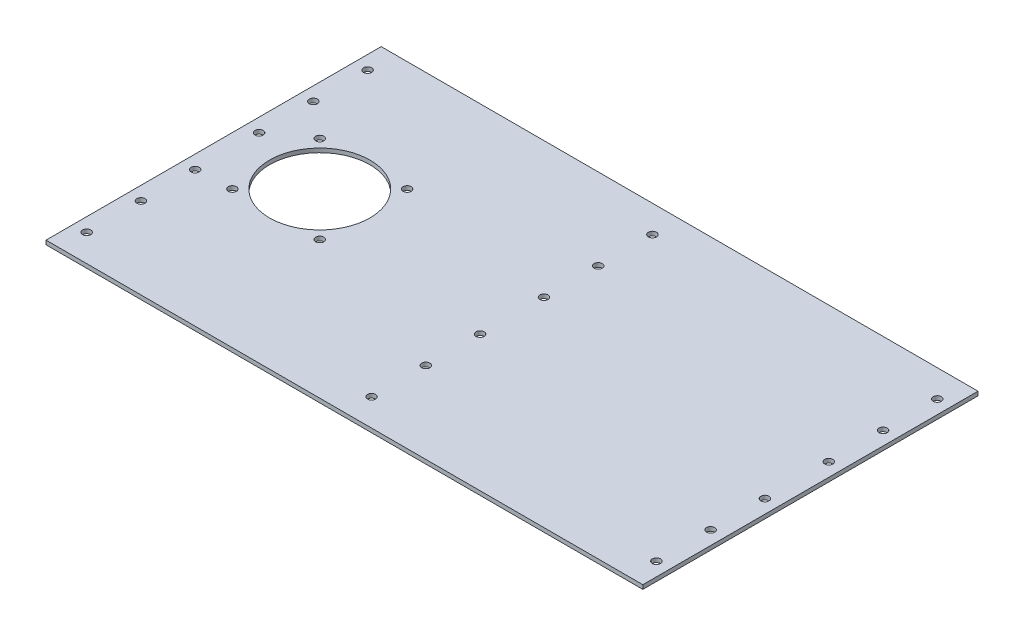
ISO-10303-21;
HEADER;
FILE_DESCRIPTION(('STEP AP214'),'2;1');
FILE_NAME('part.step','',(''),(''),'','','');
FILE_SCHEMA(('AUTOMOTIVE_DESIGN { 1 0 10303 214 1 1 1 1 }'));
ENDSEC;
DATA;
#1=APPLICATION_CONTEXT('core data for automotive mechanical design processes');
#2=APPLICATION_PROTOCOL_DEFINITION('international standard','automotive_design',2000,#1);
#3=PRODUCT_CONTEXT('',#1,'mechanical');
#4=PRODUCT('Part','Part','',(#3));
#5=PRODUCT_RELATED_PRODUCT_CATEGORY('part','',(#4));
#6=PRODUCT_DEFINITION_FORMATION('','',#4);
#7=PRODUCT_DEFINITION_CONTEXT('part definition',#1,'design');
#8=PRODUCT_DEFINITION('design','',#6,#7);
#9=PRODUCT_DEFINITION_SHAPE('','',#8);
#10=(LENGTH_UNIT() NAMED_UNIT(*) SI_UNIT(.MILLI.,.METRE.));
#11=(NAMED_UNIT(*) PLANE_ANGLE_UNIT() SI_UNIT($,.RADIAN.));
#12=(NAMED_UNIT(*) SI_UNIT($,.STERADIAN.) SOLID_ANGLE_UNIT());
#13=UNCERTAINTY_MEASURE_WITH_UNIT(LENGTH_MEASURE(1.E-05),#10,'distance_accuracy_value','');
#14=(GEOMETRIC_REPRESENTATION_CONTEXT(3) GLOBAL_UNCERTAINTY_ASSIGNED_CONTEXT((#13)) GLOBAL_UNIT_ASSIGNED_CONTEXT((#10,
#11,#12)) REPRESENTATION_CONTEXT('',''));
#15=CARTESIAN_POINT('',(0.,0.,0.));
#16=DIRECTION('',(0.,0.,1.));
#17=DIRECTION('',(1.,0.,0.));
#18=AXIS2_PLACEMENT_3D('',#15,#16,#17);
#19=CARTESIAN_POINT('',(0.,1.5,0.));
#20=DIRECTION('',(0.,1.,0.));
#21=DIRECTION('',(0.,0.,1.));
#22=AXIS2_PLACEMENT_3D('',#19,#20,#21);
#23=PLANE('',#22);
#24=CARTESIAN_POINT('',(149.295012832051,1.5,29.2327474052838));
#25=DIRECTION('',(0.,1.,0.));
#26=DIRECTION('',(0.,0.,1.));
#27=AXIS2_PLACEMENT_3D('',#24,#25,#26);
#28=CIRCLE('',#27,1.5);
#29=CARTESIAN_POINT('',(149.295012832051,1.5,30.7327474052838));
#30=VERTEX_POINT('',#29);
#31=EDGE_CURVE('E368',#30,#30,#28,.T.);
#32=ORIENTED_EDGE('',*,*,#31,.F.);
#33=EDGE_LOOP('',(#32));
#34=FACE_BOUND('',#33,.T.);
#35=CARTESIAN_POINT('',(44.295012832051,1.5,5.6827474052803));
#36=DIRECTION('',(0.,1.,0.));
#37=DIRECTION('',(0.,0.,1.));
#38=AXIS2_PLACEMENT_3D('',#35,#36,#37);
#39=CIRCLE('',#38,1.50000000000293);
#40=CARTESIAN_POINT('',(44.295012832051,1.5,7.18274740528324));
#41=VERTEX_POINT('',#40);
#42=EDGE_CURVE('E377',#41,#41,#39,.F.);
#43=ORIENTED_EDGE('',*,*,#42,.T.);
#44=EDGE_LOOP('',(#43));
#45=FACE_BOUND('',#44,.T.);
#46=CARTESIAN_POINT('',(44.2950128320511,1.5,-14.3172525947198));
#47=DIRECTION('',(0.,1.,0.));
#48=DIRECTION('',(0.,0.,1.));
#49=AXIS2_PLACEMENT_3D('',#46,#47,#48);
#50=CIRCLE('',#49,1.49999999999818);
#51=CARTESIAN_POINT('',(44.2950128320511,1.5,-12.8172525947216));
#52=VERTEX_POINT('',#51);
#53=EDGE_CURVE('E350',#52,#52,#50,.F.);
#54=ORIENTED_EDGE('',*,*,#53,.T.);
#55=EDGE_LOOP('',(#54));
#56=FACE_BOUND('',#55,.T.);
#57=CARTESIAN_POINT('',(149.295012832051,1.5,-14.3172525947162));
#58=DIRECTION('',(0.,1.,0.));
#59=DIRECTION('',(0.,0.,1.));
#60=AXIS2_PLACEMENT_3D('',#57,#58,#59);
#61=CIRCLE('',#60,1.49999999999902);
#62=CARTESIAN_POINT('',(149.295012832051,1.5,-12.8172525947171));
#63=VERTEX_POINT('',#62);
#64=EDGE_CURVE('E351',#63,#63,#61,.F.);
#65=ORIENTED_EDGE('',*,*,#64,.T.);
#66=EDGE_LOOP('',(#65));
#67=FACE_BOUND('',#66,.T.);
#68=CARTESIAN_POINT('',(-60.7049871679488,1.5,-34.3172525947235));
#69=DIRECTION('',(0.,1.,0.));
#70=DIRECTION('',(0.,0.,1.));
#71=AXIS2_PLACEMENT_3D('',#68,#69,#70);
#72=CIRCLE('',#71,1.49999999999731);
#73=CARTESIAN_POINT('',(-60.7049871679488,1.5,-32.8172525947262));
#74=VERTEX_POINT('',#73);
#75=EDGE_CURVE('E359',#74,#74,#72,.F.);
#76=ORIENTED_EDGE('',*,*,#75,.T.);
#77=EDGE_LOOP('',(#76));
#78=FACE_BOUND('',#77,.T.);
#79=DIRECTION('',(0.,0.,1.));
#80=VECTOR('',#79,1.);
#81=CARTESIAN_POINT('',(-65.7049871679489,1.5,-44.3172525947162));
#82=LINE('',#81,#80);
#83=CARTESIAN_POINT('',(-65.7049871679489,1.5,-44.3172525947162));
#84=VERTEX_POINT('',#83);
#85=CARTESIAN_POINT('',(-65.7049871679489,1.5,79.2327474052838));
#86=VERTEX_POINT('',#85);
#87=EDGE_CURVE('E113',#84,#86,#82,.T.);
#88=ORIENTED_EDGE('',*,*,#87,.T.);
#89=DIRECTION('',(1.,0.,0.));
#90=VECTOR('',#89,1.);
#91=CARTESIAN_POINT('',(-65.7049871679489,1.5,79.2327474052838));
#92=LINE('',#91,#90);
#93=CARTESIAN_POINT('',(154.295012832051,1.5,79.2327474052838));
#94=VERTEX_POINT('',#93);
#95=EDGE_CURVE('E108',#86,#94,#92,.T.);
#96=ORIENTED_EDGE('',*,*,#95,.T.);
#97=DIRECTION('',(0.,0.,-1.));
#98=VECTOR('',#97,1.);
#99=CARTESIAN_POINT('',(154.295012832051,1.5,-44.3172525947162));
#100=LINE('',#99,#98);
#101=CARTESIAN_POINT('',(154.295012832051,1.5,-44.3172525947162));
#102=VERTEX_POINT('',#101);
#103=EDGE_CURVE('E111',#94,#102,#100,.T.);
#104=ORIENTED_EDGE('',*,*,#103,.T.);
#105=DIRECTION('',(-1.,0.,0.));
#106=VECTOR('',#105,1.);
#107=CARTESIAN_POINT('',(-65.7049871679489,1.5,-44.3172525947162));
#108=LINE('',#107,#106);
#109=EDGE_CURVE('E78',#102,#84,#108,.T.);
#110=ORIENTED_EDGE('',*,*,#109,.T.);
#111=EDGE_LOOP('',(#88,#96,#104,#110));
#112=FACE_BOUND('',#111,.T.);
#113=CARTESIAN_POINT('',(149.295012832051,1.5,49.2327474052838));
#114=DIRECTION('',(0.,1.,0.));
#115=DIRECTION('',(0.,0.,1.));
#116=AXIS2_PLACEMENT_3D('',#113,#114,#115);
#117=CIRCLE('',#116,1.5);
#118=CARTESIAN_POINT('',(149.295012832051,1.5,50.7327474052838));
#119=VERTEX_POINT('',#118);
#120=EDGE_CURVE('E138',#119,#119,#117,.T.);
#121=ORIENTED_EDGE('',*,*,#120,.F.);
#122=EDGE_LOOP('',(#121));
#123=FACE_BOUND('',#122,.T.);
#124=CARTESIAN_POINT('',(-15.4703126495416,1.5,28.5577474052838));
#125=DIRECTION('',(0.,1.,0.));
#126=DIRECTION('',(0.,0.,1.));
#127=AXIS2_PLACEMENT_3D('',#124,#125,#126);
#128=CIRCLE('',#127,1.5);
#129=CARTESIAN_POINT('',(-15.4703126495416,1.5,30.0577474052838));
#130=VERTEX_POINT('',#129);
#131=EDGE_CURVE('E397',#130,#130,#128,.T.);
#132=ORIENTED_EDGE('',*,*,#131,.F.);
#133=EDGE_LOOP('',(#132));
#134=FACE_BOUND('',#133,.T.);
#135=CARTESIAN_POINT('',(-15.4703126495419,1.5,-3.64225259471624));
#136=DIRECTION('',(0.,1.,0.));
#137=DIRECTION('',(0.,0.,1.));
#138=AXIS2_PLACEMENT_3D('',#135,#136,#137);
#139=CIRCLE('',#138,1.5);
#140=CARTESIAN_POINT('',(-15.4703126495419,1.5,-2.14225259471624));
#141=VERTEX_POINT('',#140);
#142=EDGE_CURVE('E394',#141,#141,#139,.T.);
#143=ORIENTED_EDGE('',*,*,#142,.F.);
#144=EDGE_LOOP('',(#143));
#145=FACE_BOUND('',#144,.T.);
#146=CARTESIAN_POINT('',(-47.6703126495419,1.5,-3.64225259471624));
#147=DIRECTION('',(0.,1.,0.));
#148=DIRECTION('',(0.,0.,1.));
#149=AXIS2_PLACEMENT_3D('',#146,#147,#148);
#150=CIRCLE('',#149,1.5);
#151=CARTESIAN_POINT('',(-47.6703126495419,1.5,-2.14225259471624));
#152=VERTEX_POINT('',#151);
#153=EDGE_CURVE('E391',#152,#152,#150,.T.);
#154=ORIENTED_EDGE('',*,*,#153,.F.);
#155=EDGE_LOOP('',(#154));
#156=FACE_BOUND('',#155,.T.);
#157=CARTESIAN_POINT('',(149.295012832051,1.5,69.2327474052839));
#158=DIRECTION('',(0.,1.,0.));
#159=DIRECTION('',(0.,0.,1.));
#160=AXIS2_PLACEMENT_3D('',#157,#158,#159);
#161=CIRCLE('',#160,1.50000000000005);
#162=CARTESIAN_POINT('',(149.295012832051,1.5,70.732747405284));
#163=VERTEX_POINT('',#162);
#164=EDGE_CURVE('E371',#163,#163,#161,.T.);
#165=ORIENTED_EDGE('',*,*,#164,.F.);
#166=EDGE_LOOP('',(#165));
#167=FACE_BOUND('',#166,.T.);
#168=CARTESIAN_POINT('',(-31.5703126495419,1.5,12.4577474052838));
#169=DIRECTION('',(0.,1.,0.));
#170=DIRECTION('',(0.,0.,1.));
#171=AXIS2_PLACEMENT_3D('',#168,#169,#170);
#172=CIRCLE('',#171,18.5);
#173=CARTESIAN_POINT('',(-31.5703126495419,1.5,30.9577474052838));
#174=VERTEX_POINT('',#173);
#175=EDGE_CURVE('E321',#174,#174,#172,.T.);
#176=ORIENTED_EDGE('',*,*,#175,.F.);
#177=EDGE_LOOP('',(#176));
#178=FACE_BOUND('',#177,.T.);
#179=CARTESIAN_POINT('',(-47.6703126495416,1.5,28.5577474052838));
#180=DIRECTION('',(0.,1.,0.));
#181=DIRECTION('',(0.,0.,1.));
#182=AXIS2_PLACEMENT_3D('',#179,#180,#181);
#183=CIRCLE('',#182,1.5);
#184=CARTESIAN_POINT('',(-47.6703126495416,1.5,30.0577474052838));
#185=VERTEX_POINT('',#184);
#186=EDGE_CURVE('E400',#185,#185,#183,.T.);
#187=ORIENTED_EDGE('',*,*,#186,.F.);
#188=EDGE_LOOP('',(#187));
#189=FACE_BOUND('',#188,.T.);
#190=CARTESIAN_POINT('',(-60.7049871679489,1.5,-14.3172525947234));
#191=DIRECTION('',(0.,1.,0.));
#192=DIRECTION('',(0.,0.,1.));
#193=AXIS2_PLACEMENT_3D('',#190,#191,#192);
#194=CIRCLE('',#193,1.49999999999733);
#195=CARTESIAN_POINT('',(-60.7049871679489,1.5,-12.8172525947261));
#196=VERTEX_POINT('',#195);
#197=EDGE_CURVE('E356',#196,#196,#194,.F.);
#198=ORIENTED_EDGE('',*,*,#197,.T.);
#199=EDGE_LOOP('',(#198));
#200=FACE_BOUND('',#199,.T.);
#201=CARTESIAN_POINT('',(149.295012832051,1.5,-34.3172525947162));
#202=DIRECTION('',(0.,1.,0.));
#203=DIRECTION('',(0.,0.,1.));
#204=AXIS2_PLACEMENT_3D('',#201,#202,#203);
#205=CIRCLE('',#204,1.49999999999899);
#206=CARTESIAN_POINT('',(149.295012832051,1.5,-32.8172525947173));
#207=VERTEX_POINT('',#206);
#208=EDGE_CURVE('E363',#207,#207,#205,.F.);
#209=ORIENTED_EDGE('',*,*,#208,.T.);
#210=EDGE_LOOP('',(#209));
#211=FACE_BOUND('',#210,.T.);
#212=CARTESIAN_POINT('',(44.2950128320512,1.5,-34.3172525947199));
#213=DIRECTION('',(0.,1.,0.));
#214=DIRECTION('',(0.,0.,1.));
#215=AXIS2_PLACEMENT_3D('',#212,#213,#214);
#216=CIRCLE('',#215,1.49999999999815);
#217=CARTESIAN_POINT('',(44.2950128320512,1.5,-32.8172525947217));
#218=VERTEX_POINT('',#217);
#219=EDGE_CURVE('E347',#218,#218,#216,.F.);
#220=ORIENTED_EDGE('',*,*,#219,.T.);
#221=EDGE_LOOP('',(#220));
#222=FACE_BOUND('',#221,.T.);
#223=CARTESIAN_POINT('',(44.2950128320508,1.5,69.2327474052874));
#224=DIRECTION('',(0.,1.,0.));
#225=DIRECTION('',(0.,0.,1.));
#226=AXIS2_PLACEMENT_3D('',#223,#224,#225);
#227=CIRCLE('',#226,1.5);
#228=CARTESIAN_POINT('',(44.2950128320508,1.5,70.7327474052874));
#229=VERTEX_POINT('',#228);
#230=EDGE_CURVE('E344',#229,#229,#227,.T.);
#231=ORIENTED_EDGE('',*,*,#230,.F.);
#232=EDGE_LOOP('',(#231));
#233=FACE_BOUND('',#232,.T.);
#234=CARTESIAN_POINT('',(44.2950128320508,1.5,49.2327474052874));
#235=DIRECTION('',(0.,1.,0.));
#236=DIRECTION('',(0.,0.,1.));
#237=AXIS2_PLACEMENT_3D('',#234,#235,#236);
#238=CIRCLE('',#237,1.5);
#239=CARTESIAN_POINT('',(44.2950128320508,1.5,50.7327474052874));
#240=VERTEX_POINT('',#239);
#241=EDGE_CURVE('E341',#240,#240,#238,.T.);
#242=ORIENTED_EDGE('',*,*,#241,.F.);
#243=EDGE_LOOP('',(#242));
#244=FACE_BOUND('',#243,.T.);
#245=CARTESIAN_POINT('',(-60.7049871679492,1.5,49.232747405291));
#246=DIRECTION('',(0.,1.,0.));
#247=DIRECTION('',(0.,0.,1.));
#248=AXIS2_PLACEMENT_3D('',#245,#246,#247);
#249=CIRCLE('',#248,1.5);
#250=CARTESIAN_POINT('',(-60.7049871679492,1.5,50.732747405291));
#251=VERTEX_POINT('',#250);
#252=EDGE_CURVE('E360',#251,#251,#249,.T.);
#253=ORIENTED_EDGE('',*,*,#252,.F.);
#254=EDGE_LOOP('',(#253));
#255=FACE_BOUND('',#254,.T.);
#256=CARTESIAN_POINT('',(-60.7049871679492,1.5,69.232747405291));
#257=DIRECTION('',(0.,1.,0.));
#258=DIRECTION('',(0.,0.,1.));
#259=AXIS2_PLACEMENT_3D('',#256,#257,#258);
#260=CIRCLE('',#259,1.5);
#261=CARTESIAN_POINT('',(-60.7049871679492,1.5,70.732747405291));
#262=VERTEX_POINT('',#261);
#263=EDGE_CURVE('E386',#262,#262,#260,.T.);
#264=ORIENTED_EDGE('',*,*,#263,.F.);
#265=EDGE_LOOP('',(#264));
#266=FACE_BOUND('',#265,.T.);
#267=CARTESIAN_POINT('',(-60.7049871679493,1.5,29.232747405291));
#268=DIRECTION('',(0.,1.,0.));
#269=DIRECTION('',(0.,0.,1.));
#270=AXIS2_PLACEMENT_3D('',#267,#268,#269);
#271=CIRCLE('',#270,1.5);
#272=CARTESIAN_POINT('',(-60.7049871679493,1.5,30.732747405291));
#273=VERTEX_POINT('',#272);
#274=EDGE_CURVE('E383',#273,#273,#271,.T.);
#275=ORIENTED_EDGE('',*,*,#274,.F.);
#276=EDGE_LOOP('',(#275));
#277=FACE_BOUND('',#276,.T.);
#278=CARTESIAN_POINT('',(-60.704987167949,1.5,5.68274740527668));
#279=DIRECTION('',(0.,1.,0.));
#280=DIRECTION('',(0.,0.,1.));
#281=AXIS2_PLACEMENT_3D('',#278,#279,#280);
#282=CIRCLE('',#281,1.50000000000336);
#283=CARTESIAN_POINT('',(-60.704987167949,1.5,7.18274740528003));
#284=VERTEX_POINT('',#283);
#285=EDGE_CURVE('E380',#284,#284,#282,.F.);
#286=ORIENTED_EDGE('',*,*,#285,.T.);
#287=EDGE_LOOP('',(#286));
#288=FACE_BOUND('',#287,.T.);
#289=CARTESIAN_POINT('',(44.2950128320507,1.5,29.2327474052874));
#290=DIRECTION('',(0.,1.,0.));
#291=DIRECTION('',(0.,0.,1.));
#292=AXIS2_PLACEMENT_3D('',#289,#290,#291);
#293=CIRCLE('',#292,1.5);
#294=CARTESIAN_POINT('',(44.2950128320507,1.5,30.7327474052874));
#295=VERTEX_POINT('',#294);
#296=EDGE_CURVE('E374',#295,#295,#293,.T.);
#297=ORIENTED_EDGE('',*,*,#296,.F.);
#298=EDGE_LOOP('',(#297));
#299=FACE_BOUND('',#298,.T.);
#300=CARTESIAN_POINT('',(149.295012832051,1.5,5.68274740528393));
#301=DIRECTION('',(0.,1.,0.));
#302=DIRECTION('',(0.,0.,1.));
#303=AXIS2_PLACEMENT_3D('',#300,#301,#302);
#304=CIRCLE('',#303,1.50000000000251);
#305=CARTESIAN_POINT('',(149.295012832051,1.5,7.18274740528644));
#306=VERTEX_POINT('',#305);
#307=EDGE_CURVE('E370',#306,#306,#304,.F.);
#308=ORIENTED_EDGE('',*,*,#307,.T.);
#309=EDGE_LOOP('',(#308));
#310=FACE_BOUND('',#309,.T.);
#311=ADVANCED_FACE('F59',(#34,#45,#56,#67,#78,#112,#123,#134,#145,#156,#167,#178,#189,#200,#211,
#222,#233,#244,#255,#266,#277,#288,#299,#310),#23,.T.);
#312=CARTESIAN_POINT('',(0.,0.,0.));
#313=DIRECTION('',(0.,1.,0.));
#314=DIRECTION('',(0.,0.,1.));
#315=AXIS2_PLACEMENT_3D('',#312,#313,#314);
#316=PLANE('',#315);
#317=CARTESIAN_POINT('',(149.295012832051,0.,29.2327474052838));
#318=DIRECTION('',(0.,1.,0.));
#319=DIRECTION('',(0.,0.,1.));
#320=AXIS2_PLACEMENT_3D('',#317,#318,#319);
#321=CIRCLE('',#320,1.5);
#322=CARTESIAN_POINT('',(149.295012832051,0.,30.7327474052838));
#323=VERTEX_POINT('',#322);
#324=EDGE_CURVE('E63',#323,#323,#321,.T.);
#325=ORIENTED_EDGE('',*,*,#324,.T.);
#326=EDGE_LOOP('',(#325));
#327=FACE_BOUND('',#326,.T.);
#328=CARTESIAN_POINT('',(44.2950128320507,0.,29.2327474052874));
#329=DIRECTION('',(0.,1.,0.));
#330=DIRECTION('',(0.,0.,1.));
#331=AXIS2_PLACEMENT_3D('',#328,#329,#330);
#332=CIRCLE('',#331,1.5);
#333=CARTESIAN_POINT('',(44.2950128320507,0.,30.7327474052874));
#334=VERTEX_POINT('',#333);
#335=EDGE_CURVE('E195',#334,#334,#332,.T.);
#336=ORIENTED_EDGE('',*,*,#335,.T.);
#337=EDGE_LOOP('',(#336));
#338=FACE_BOUND('',#337,.T.);
#339=CARTESIAN_POINT('',(-60.7049871679493,0.,29.232747405291));
#340=DIRECTION('',(0.,1.,0.));
#341=DIRECTION('',(0.,0.,1.));
#342=AXIS2_PLACEMENT_3D('',#339,#340,#341);
#343=CIRCLE('',#342,1.5);
#344=CARTESIAN_POINT('',(-60.7049871679493,0.,30.732747405291));
#345=VERTEX_POINT('',#344);
#346=EDGE_CURVE('E186',#345,#345,#343,.T.);
#347=ORIENTED_EDGE('',*,*,#346,.T.);
#348=EDGE_LOOP('',(#347));
#349=FACE_BOUND('',#348,.T.);
#350=CARTESIAN_POINT('',(-60.7049871679492,0.,69.232747405291));
#351=DIRECTION('',(0.,1.,0.));
#352=DIRECTION('',(0.,0.,1.));
#353=AXIS2_PLACEMENT_3D('',#350,#351,#352);
#354=CIRCLE('',#353,1.5);
#355=CARTESIAN_POINT('',(-60.7049871679492,0.,70.732747405291));
#356=VERTEX_POINT('',#355);
#357=EDGE_CURVE('E183',#356,#356,#354,.T.);
#358=ORIENTED_EDGE('',*,*,#357,.T.);
#359=EDGE_LOOP('',(#358));
#360=FACE_BOUND('',#359,.T.);
#361=CARTESIAN_POINT('',(-60.7049871679492,0.,49.232747405291));
#362=DIRECTION('',(0.,1.,0.));
#363=DIRECTION('',(0.,0.,1.));
#364=AXIS2_PLACEMENT_3D('',#361,#362,#363);
#365=CIRCLE('',#364,1.5);
#366=CARTESIAN_POINT('',(-60.7049871679492,0.,50.732747405291));
#367=VERTEX_POINT('',#366);
#368=EDGE_CURVE('E180',#367,#367,#365,.T.);
#369=ORIENTED_EDGE('',*,*,#368,.T.);
#370=EDGE_LOOP('',(#369));
#371=FACE_BOUND('',#370,.T.);
#372=CARTESIAN_POINT('',(44.2950128320508,0.,49.2327474052874));
#373=DIRECTION('',(0.,1.,0.));
#374=DIRECTION('',(0.,0.,1.));
#375=AXIS2_PLACEMENT_3D('',#372,#373,#374);
#376=CIRCLE('',#375,1.5);
#377=CARTESIAN_POINT('',(44.2950128320508,0.,50.7327474052874));
#378=VERTEX_POINT('',#377);
#379=EDGE_CURVE('E177',#378,#378,#376,.T.);
#380=ORIENTED_EDGE('',*,*,#379,.T.);
#381=EDGE_LOOP('',(#380));
#382=FACE_BOUND('',#381,.T.);
#383=CARTESIAN_POINT('',(44.2950128320508,0.,69.2327474052874));
#384=DIRECTION('',(0.,1.,0.));
#385=DIRECTION('',(0.,0.,1.));
#386=AXIS2_PLACEMENT_3D('',#383,#384,#385);
#387=CIRCLE('',#386,1.5);
#388=CARTESIAN_POINT('',(44.2950128320508,0.,70.7327474052874));
#389=VERTEX_POINT('',#388);
#390=EDGE_CURVE('E174',#389,#389,#387,.T.);
#391=ORIENTED_EDGE('',*,*,#390,.T.);
#392=EDGE_LOOP('',(#391));
#393=FACE_BOUND('',#392,.T.);
#394=CARTESIAN_POINT('',(-47.6703126495416,0.,28.5577474052838));
#395=DIRECTION('',(0.,1.,0.));
#396=DIRECTION('',(0.,0.,1.));
#397=AXIS2_PLACEMENT_3D('',#394,#395,#396);
#398=CIRCLE('',#397,1.5);
#399=CARTESIAN_POINT('',(-47.6703126495416,0.,30.0577474052838));
#400=VERTEX_POINT('',#399);
#401=EDGE_CURVE('E153',#400,#400,#398,.T.);
#402=ORIENTED_EDGE('',*,*,#401,.T.);
#403=EDGE_LOOP('',(#402));
#404=FACE_BOUND('',#403,.T.);
#405=CARTESIAN_POINT('',(-31.5703126495419,0.,12.4577474052838));
#406=DIRECTION('',(0.,1.,0.));
#407=DIRECTION('',(0.,0.,1.));
#408=AXIS2_PLACEMENT_3D('',#405,#406,#407);
#409=CIRCLE('',#408,18.5);
#410=CARTESIAN_POINT('',(-31.5703126495419,0.,30.9577474052838));
#411=VERTEX_POINT('',#410);
#412=EDGE_CURVE('E150',#411,#411,#409,.T.);
#413=ORIENTED_EDGE('',*,*,#412,.T.);
#414=EDGE_LOOP('',(#413));
#415=FACE_BOUND('',#414,.T.);
#416=CARTESIAN_POINT('',(149.295012832051,0.,69.2327474052839));
#417=DIRECTION('',(0.,1.,0.));
#418=DIRECTION('',(0.,0.,1.));
#419=AXIS2_PLACEMENT_3D('',#416,#417,#418);
#420=CIRCLE('',#419,1.50000000000005);
#421=CARTESIAN_POINT('',(149.295012832051,0.,70.732747405284));
#422=VERTEX_POINT('',#421);
#423=EDGE_CURVE('E147',#422,#422,#420,.T.);
#424=ORIENTED_EDGE('',*,*,#423,.T.);
#425=EDGE_LOOP('',(#424));
#426=FACE_BOUND('',#425,.T.);
#427=CARTESIAN_POINT('',(-47.6703126495419,0.,-3.64225259471624));
#428=DIRECTION('',(0.,1.,0.));
#429=DIRECTION('',(0.,0.,1.));
#430=AXIS2_PLACEMENT_3D('',#427,#428,#429);
#431=CIRCLE('',#430,1.5);
#432=CARTESIAN_POINT('',(-47.6703126495419,0.,-2.14225259471624));
#433=VERTEX_POINT('',#432);
#434=EDGE_CURVE('E144',#433,#433,#431,.T.);
#435=ORIENTED_EDGE('',*,*,#434,.T.);
#436=EDGE_LOOP('',(#435));
#437=FACE_BOUND('',#436,.T.);
#438=CARTESIAN_POINT('',(-15.4703126495419,0.,-3.64225259471624));
#439=DIRECTION('',(0.,1.,0.));
#440=DIRECTION('',(0.,0.,1.));
#441=AXIS2_PLACEMENT_3D('',#438,#439,#440);
#442=CIRCLE('',#441,1.5);
#443=CARTESIAN_POINT('',(-15.4703126495419,0.,-2.14225259471624));
#444=VERTEX_POINT('',#443);
#445=EDGE_CURVE('E141',#444,#444,#442,.T.);
#446=ORIENTED_EDGE('',*,*,#445,.T.);
#447=EDGE_LOOP('',(#446));
#448=FACE_BOUND('',#447,.T.);
#449=CARTESIAN_POINT('',(-15.4703126495416,0.,28.5577474052838));
#450=DIRECTION('',(0.,1.,0.));
#451=DIRECTION('',(0.,0.,1.));
#452=AXIS2_PLACEMENT_3D('',#449,#450,#451);
#453=CIRCLE('',#452,1.5);
#454=CARTESIAN_POINT('',(-15.4703126495416,0.,30.0577474052838));
#455=VERTEX_POINT('',#454);
#456=EDGE_CURVE('E137',#455,#455,#453,.T.);
#457=ORIENTED_EDGE('',*,*,#456,.T.);
#458=EDGE_LOOP('',(#457));
#459=FACE_BOUND('',#458,.T.);
#460=CARTESIAN_POINT('',(149.295012832051,0.,49.2327474052838));
#461=DIRECTION('',(0.,1.,0.));
#462=DIRECTION('',(0.,0.,1.));
#463=AXIS2_PLACEMENT_3D('',#460,#461,#462);
#464=CIRCLE('',#463,1.5);
#465=CARTESIAN_POINT('',(149.295012832051,0.,50.7327474052838));
#466=VERTEX_POINT('',#465);
#467=EDGE_CURVE('E134',#466,#466,#464,.T.);
#468=ORIENTED_EDGE('',*,*,#467,.T.);
#469=EDGE_LOOP('',(#468));
#470=FACE_BOUND('',#469,.T.);
#471=DIRECTION('',(0.,0.,1.));
#472=VECTOR('',#471,1.);
#473=CARTESIAN_POINT('',(-65.7049871679489,0.,-44.3172525947162));
#474=LINE('',#473,#472);
#475=CARTESIAN_POINT('',(-65.7049871679489,0.,-44.3172525947162));
#476=VERTEX_POINT('',#475);
#477=CARTESIAN_POINT('',(-65.7049871679489,0.,79.2327474052838));
#478=VERTEX_POINT('',#477);
#479=EDGE_CURVE('E126',#476,#478,#474,.T.);
#480=ORIENTED_EDGE('',*,*,#479,.F.);
#481=DIRECTION('',(-1.,0.,0.));
#482=VECTOR('',#481,1.);
#483=CARTESIAN_POINT('',(-65.7049871679489,0.,-44.3172525947162));
#484=LINE('',#483,#482);
#485=CARTESIAN_POINT('',(154.295012832051,0.,-44.3172525947162));
#486=VERTEX_POINT('',#485);
#487=EDGE_CURVE('E101',#486,#476,#484,.T.);
#488=ORIENTED_EDGE('',*,*,#487,.F.);
#489=DIRECTION('',(0.,0.,-1.));
#490=VECTOR('',#489,1.);
#491=CARTESIAN_POINT('',(154.295012832051,0.,-44.3172525947162));
#492=LINE('',#491,#490);
#493=CARTESIAN_POINT('',(154.295012832051,0.,79.2327474052838));
#494=VERTEX_POINT('',#493);
#495=EDGE_CURVE('E95',#494,#486,#492,.T.);
#496=ORIENTED_EDGE('',*,*,#495,.F.);
#497=DIRECTION('',(1.,0.,0.));
#498=VECTOR('',#497,1.);
#499=CARTESIAN_POINT('',(-65.7049871679489,0.,79.2327474052838));
#500=LINE('',#499,#498);
#501=EDGE_CURVE('E117',#478,#494,#500,.T.);
#502=ORIENTED_EDGE('',*,*,#501,.F.);
#503=EDGE_LOOP('',(#480,#488,#496,#502));
#504=FACE_BOUND('',#503,.T.);
#505=CARTESIAN_POINT('',(-60.7049871679489,0.,-14.3172525947234));
#506=DIRECTION('',(0.,1.,0.));
#507=DIRECTION('',(0.,0.,1.));
#508=AXIS2_PLACEMENT_3D('',#505,#506,#507);
#509=CIRCLE('',#508,1.49999999999733);
#510=CARTESIAN_POINT('',(-60.7049871679489,0.,-12.8172525947261));
#511=VERTEX_POINT('',#510);
#512=EDGE_CURVE('E156',#511,#511,#509,.F.);
#513=ORIENTED_EDGE('',*,*,#512,.F.);
#514=EDGE_LOOP('',(#513));
#515=FACE_BOUND('',#514,.T.);
#516=CARTESIAN_POINT('',(-60.7049871679488,0.,-34.3172525947235));
#517=DIRECTION('',(0.,1.,0.));
#518=DIRECTION('',(0.,0.,1.));
#519=AXIS2_PLACEMENT_3D('',#516,#517,#518);
#520=CIRCLE('',#519,1.49999999999731);
#521=CARTESIAN_POINT('',(-60.7049871679488,0.,-32.8172525947262));
#522=VERTEX_POINT('',#521);
#523=EDGE_CURVE('E159',#522,#522,#520,.F.);
#524=ORIENTED_EDGE('',*,*,#523,.F.);
#525=EDGE_LOOP('',(#524));
#526=FACE_BOUND('',#525,.T.);
#527=CARTESIAN_POINT('',(149.295012832051,0.,-34.3172525947162));
#528=DIRECTION('',(0.,1.,0.));
#529=DIRECTION('',(0.,0.,1.));
#530=AXIS2_PLACEMENT_3D('',#527,#528,#529);
#531=CIRCLE('',#530,1.49999999999899);
#532=CARTESIAN_POINT('',(149.295012832051,0.,-32.8172525947173));
#533=VERTEX_POINT('',#532);
#534=EDGE_CURVE('E162',#533,#533,#531,.F.);
#535=ORIENTED_EDGE('',*,*,#534,.F.);
#536=EDGE_LOOP('',(#535));
#537=FACE_BOUND('',#536,.T.);
#538=CARTESIAN_POINT('',(149.295012832051,0.,-14.3172525947162));
#539=DIRECTION('',(0.,1.,0.));
#540=DIRECTION('',(0.,0.,1.));
#541=AXIS2_PLACEMENT_3D('',#538,#539,#540);
#542=CIRCLE('',#541,1.49999999999902);
#543=CARTESIAN_POINT('',(149.295012832051,0.,-12.8172525947171));
#544=VERTEX_POINT('',#543);
#545=EDGE_CURVE('E165',#544,#544,#542,.F.);
#546=ORIENTED_EDGE('',*,*,#545,.F.);
#547=EDGE_LOOP('',(#546));
#548=FACE_BOUND('',#547,.T.);
#549=CARTESIAN_POINT('',(44.2950128320512,0.,-34.3172525947199));
#550=DIRECTION('',(0.,1.,0.));
#551=DIRECTION('',(0.,0.,1.));
#552=AXIS2_PLACEMENT_3D('',#549,#550,#551);
#553=CIRCLE('',#552,1.49999999999815);
#554=CARTESIAN_POINT('',(44.2950128320512,0.,-32.8172525947217));
#555=VERTEX_POINT('',#554);
#556=EDGE_CURVE('E168',#555,#555,#553,.F.);
#557=ORIENTED_EDGE('',*,*,#556,.F.);
#558=EDGE_LOOP('',(#557));
#559=FACE_BOUND('',#558,.T.);
#560=CARTESIAN_POINT('',(44.2950128320511,0.,-14.3172525947198));
#561=DIRECTION('',(0.,1.,0.));
#562=DIRECTION('',(0.,0.,1.));
#563=AXIS2_PLACEMENT_3D('',#560,#561,#562);
#564=CIRCLE('',#563,1.49999999999818);
#565=CARTESIAN_POINT('',(44.2950128320511,0.,-12.8172525947216));
#566=VERTEX_POINT('',#565);
#567=EDGE_CURVE('E171',#566,#566,#564,.F.);
#568=ORIENTED_EDGE('',*,*,#567,.F.);
#569=EDGE_LOOP('',(#568));
#570=FACE_BOUND('',#569,.T.);
#571=CARTESIAN_POINT('',(-60.704987167949,0.,5.68274740527668));
#572=DIRECTION('',(0.,1.,0.));
#573=DIRECTION('',(0.,0.,1.));
#574=AXIS2_PLACEMENT_3D('',#571,#572,#573);
#575=CIRCLE('',#574,1.50000000000336);
#576=CARTESIAN_POINT('',(-60.704987167949,0.,7.18274740528003));
#577=VERTEX_POINT('',#576);
#578=EDGE_CURVE('E189',#577,#577,#575,.F.);
#579=ORIENTED_EDGE('',*,*,#578,.F.);
#580=EDGE_LOOP('',(#579));
#581=FACE_BOUND('',#580,.T.);
#582=CARTESIAN_POINT('',(44.295012832051,0.,5.6827474052803));
#583=DIRECTION('',(0.,1.,0.));
#584=DIRECTION('',(0.,0.,1.));
#585=AXIS2_PLACEMENT_3D('',#582,#583,#584);
#586=CIRCLE('',#585,1.50000000000293);
#587=CARTESIAN_POINT('',(44.295012832051,0.,7.18274740528324));
#588=VERTEX_POINT('',#587);
#589=EDGE_CURVE('E192',#588,#588,#586,.F.);
#590=ORIENTED_EDGE('',*,*,#589,.F.);
#591=EDGE_LOOP('',(#590));
#592=FACE_BOUND('',#591,.T.);
#593=CARTESIAN_POINT('',(149.295012832051,0.,5.68274740528393));
#594=DIRECTION('',(0.,1.,0.));
#595=DIRECTION('',(0.,0.,1.));
#596=AXIS2_PLACEMENT_3D('',#593,#594,#595);
#597=CIRCLE('',#596,1.50000000000251);
#598=CARTESIAN_POINT('',(149.295012832051,0.,7.18274740528644));
#599=VERTEX_POINT('',#598);
#600=EDGE_CURVE('E197',#599,#599,#597,.F.);
#601=ORIENTED_EDGE('',*,*,#600,.F.);
#602=EDGE_LOOP('',(#601));
#603=FACE_BOUND('',#602,.T.);
#604=ADVANCED_FACE('F204',(#327,#338,#349,#360,#371,#382,#393,#404,#415,#426,#437,#448,#459,
#470,#504,#515,#526,#537,#548,#559,#570,#581,#592,#603),#316,.F.);
#605=CARTESIAN_POINT('',(-65.7049871679489,1.5,-44.3172525947162));
#606=DIRECTION('',(1.,0.,0.));
#607=DIRECTION('',(0.,0.,-1.));
#608=AXIS2_PLACEMENT_3D('',#605,#606,#607);
#609=PLANE('',#608);
#610=ORIENTED_EDGE('',*,*,#479,.T.);
#611=DIRECTION('',(0.,-1.,0.));
#612=VECTOR('',#611,1.);
#613=CARTESIAN_POINT('',(-65.7049871679489,1.5,79.2327474052838));
#614=LINE('',#613,#612);
#615=EDGE_CURVE('E12',#86,#478,#614,.T.);
#616=ORIENTED_EDGE('',*,*,#615,.F.);
#617=ORIENTED_EDGE('',*,*,#87,.F.);
#618=DIRECTION('',(0.,-1.,0.));
#619=VECTOR('',#618,1.);
#620=CARTESIAN_POINT('',(-65.7049871679489,1.5,-44.3172525947162));
#621=LINE('',#620,#619);
#622=EDGE_CURVE('E122',#84,#476,#621,.T.);
#623=ORIENTED_EDGE('',*,*,#622,.T.);
#624=EDGE_LOOP('',(#610,#616,#617,#623));
#625=FACE_BOUND('',#624,.T.);
#626=ADVANCED_FACE('F61',(#625),#609,.F.);
#627=CARTESIAN_POINT('',(-65.7049871679489,1.5,79.2327474052838));
#628=DIRECTION('',(0.,0.,-1.));
#629=DIRECTION('',(-1.,0.,0.));
#630=AXIS2_PLACEMENT_3D('',#627,#628,#629);
#631=PLANE('',#630);
#632=ORIENTED_EDGE('',*,*,#501,.T.);
#633=DIRECTION('',(0.,-1.,0.));
#634=VECTOR('',#633,1.);
#635=CARTESIAN_POINT('',(154.295012832051,1.5,79.2327474052838));
#636=LINE('',#635,#634);
#637=EDGE_CURVE('E69',#94,#494,#636,.T.);
#638=ORIENTED_EDGE('',*,*,#637,.F.);
#639=ORIENTED_EDGE('',*,*,#95,.F.);
#640=ORIENTED_EDGE('',*,*,#615,.T.);
#641=EDGE_LOOP('',(#632,#638,#639,#640));
#642=FACE_BOUND('',#641,.T.);
#643=ADVANCED_FACE('F116',(#642),#631,.F.);
#644=CARTESIAN_POINT('',(154.295012832051,1.5,-44.3172525947162));
#645=DIRECTION('',(-1.,0.,0.));
#646=DIRECTION('',(0.,0.,1.));
#647=AXIS2_PLACEMENT_3D('',#644,#645,#646);
#648=PLANE('',#647);
#649=ORIENTED_EDGE('',*,*,#495,.T.);
#650=DIRECTION('',(0.,-1.,0.));
#651=VECTOR('',#650,1.);
#652=CARTESIAN_POINT('',(154.295012832051,1.5,-44.3172525947162));
#653=LINE('',#652,#651);
#654=EDGE_CURVE('E118',#102,#486,#653,.T.);
#655=ORIENTED_EDGE('',*,*,#654,.F.);
#656=ORIENTED_EDGE('',*,*,#103,.F.);
#657=ORIENTED_EDGE('',*,*,#637,.T.);
#658=EDGE_LOOP('',(#649,#655,#656,#657));
#659=FACE_BOUND('',#658,.T.);
#660=ADVANCED_FACE('F120',(#659),#648,.F.);
#661=CARTESIAN_POINT('',(-65.7049871679489,1.5,-44.3172525947162));
#662=DIRECTION('',(0.,0.,1.));
#663=DIRECTION('',(1.,0.,0.));
#664=AXIS2_PLACEMENT_3D('',#661,#662,#663);
#665=PLANE('',#664);
#666=ORIENTED_EDGE('',*,*,#487,.T.);
#667=ORIENTED_EDGE('',*,*,#622,.F.);
#668=ORIENTED_EDGE('',*,*,#109,.F.);
#669=ORIENTED_EDGE('',*,*,#654,.T.);
#670=EDGE_LOOP('',(#666,#667,#668,#669));
#671=FACE_BOUND('',#670,.T.);
#672=ADVANCED_FACE('F233',(#671),#665,.F.);
#673=CARTESIAN_POINT('',(149.295012832051,-8.5,49.2327474052838));
#674=DIRECTION('',(0.,1.,0.));
#675=DIRECTION('',(0.,0.,1.));
#676=AXIS2_PLACEMENT_3D('',#673,#674,#675);
#677=CYLINDRICAL_SURFACE('',#676,1.5);
#678=ORIENTED_EDGE('',*,*,#120,.T.);
#679=EDGE_LOOP('',(#678));
#680=FACE_BOUND('',#679,.T.);
#681=ORIENTED_EDGE('',*,*,#467,.F.);
#682=EDGE_LOOP('',(#681));
#683=FACE_BOUND('',#682,.T.);
#684=ADVANCED_FACE('F230',(#680,#683),#677,.F.);
#685=CARTESIAN_POINT('',(-15.4703126495416,-8.5,28.5577474052838));
#686=DIRECTION('',(0.,1.,0.));
#687=DIRECTION('',(0.,0.,1.));
#688=AXIS2_PLACEMENT_3D('',#685,#686,#687);
#689=CYLINDRICAL_SURFACE('',#688,1.5);
#690=ORIENTED_EDGE('',*,*,#131,.T.);
#691=EDGE_LOOP('',(#690));
#692=FACE_BOUND('',#691,.T.);
#693=ORIENTED_EDGE('',*,*,#456,.F.);
#694=EDGE_LOOP('',(#693));
#695=FACE_BOUND('',#694,.T.);
#696=ADVANCED_FACE('F302',(#692,#695),#689,.F.);
#697=CARTESIAN_POINT('',(-15.4703126495419,-8.5,-3.64225259471624));
#698=DIRECTION('',(0.,1.,0.));
#699=DIRECTION('',(0.,0.,1.));
#700=AXIS2_PLACEMENT_3D('',#697,#698,#699);
#701=CYLINDRICAL_SURFACE('',#700,1.5);
#702=ORIENTED_EDGE('',*,*,#142,.T.);
#703=EDGE_LOOP('',(#702));
#704=FACE_BOUND('',#703,.T.);
#705=ORIENTED_EDGE('',*,*,#445,.F.);
#706=EDGE_LOOP('',(#705));
#707=FACE_BOUND('',#706,.T.);
#708=ADVANCED_FACE('F296',(#704,#707),#701,.F.);
#709=CARTESIAN_POINT('',(-47.6703126495419,-8.5,-3.64225259471624));
#710=DIRECTION('',(0.,1.,0.));
#711=DIRECTION('',(0.,0.,1.));
#712=AXIS2_PLACEMENT_3D('',#709,#710,#711);
#713=CYLINDRICAL_SURFACE('',#712,1.5);
#714=ORIENTED_EDGE('',*,*,#153,.T.);
#715=EDGE_LOOP('',(#714));
#716=FACE_BOUND('',#715,.T.);
#717=ORIENTED_EDGE('',*,*,#434,.F.);
#718=EDGE_LOOP('',(#717));
#719=FACE_BOUND('',#718,.T.);
#720=ADVANCED_FACE('F292',(#716,#719),#713,.F.);
#721=CARTESIAN_POINT('',(149.295012832051,-8.5,69.2327474052839));
#722=DIRECTION('',(0.,1.,0.));
#723=DIRECTION('',(0.,0.,1.));
#724=AXIS2_PLACEMENT_3D('',#721,#722,#723);
#725=CYLINDRICAL_SURFACE('',#724,1.50000000000005);
#726=ORIENTED_EDGE('',*,*,#164,.T.);
#727=EDGE_LOOP('',(#726));
#728=FACE_BOUND('',#727,.T.);
#729=ORIENTED_EDGE('',*,*,#423,.F.);
#730=EDGE_LOOP('',(#729));
#731=FACE_BOUND('',#730,.T.);
#732=ADVANCED_FACE('F295',(#728,#731),#725,.F.);
#733=CARTESIAN_POINT('',(-31.5703126495419,-8.5,12.4577474052838));
#734=DIRECTION('',(0.,1.,0.));
#735=DIRECTION('',(0.,0.,1.));
#736=AXIS2_PLACEMENT_3D('',#733,#734,#735);
#737=CYLINDRICAL_SURFACE('',#736,18.5);
#738=ORIENTED_EDGE('',*,*,#175,.T.);
#739=EDGE_LOOP('',(#738));
#740=FACE_BOUND('',#739,.T.);
#741=ORIENTED_EDGE('',*,*,#412,.F.);
#742=EDGE_LOOP('',(#741));
#743=FACE_BOUND('',#742,.T.);
#744=ADVANCED_FACE('F300',(#740,#743),#737,.F.);
#745=CARTESIAN_POINT('',(-47.6703126495416,-8.5,28.5577474052838));
#746=DIRECTION('',(0.,1.,0.));
#747=DIRECTION('',(0.,0.,1.));
#748=AXIS2_PLACEMENT_3D('',#745,#746,#747);
#749=CYLINDRICAL_SURFACE('',#748,1.5);
#750=ORIENTED_EDGE('',*,*,#186,.T.);
#751=EDGE_LOOP('',(#750));
#752=FACE_BOUND('',#751,.T.);
#753=ORIENTED_EDGE('',*,*,#401,.F.);
#754=EDGE_LOOP('',(#753));
#755=FACE_BOUND('',#754,.T.);
#756=ADVANCED_FACE('F309',(#752,#755),#749,.F.);
#757=CARTESIAN_POINT('',(-60.7049871679489,-8.5,-14.3172525947234));
#758=DIRECTION('',(0.,1.,0.));
#759=DIRECTION('',(0.,0.,1.));
#760=AXIS2_PLACEMENT_3D('',#757,#758,#759);
#761=CYLINDRICAL_SURFACE('',#760,1.49999999999733);
#762=ORIENTED_EDGE('',*,*,#197,.F.);
#763=EDGE_LOOP('',(#762));
#764=FACE_BOUND('',#763,.T.);
#765=ORIENTED_EDGE('',*,*,#512,.T.);
#766=EDGE_LOOP('',(#765));
#767=FACE_BOUND('',#766,.T.);
#768=ADVANCED_FACE('F312',(#764,#767),#761,.F.);
#769=CARTESIAN_POINT('',(-60.7049871679488,-8.5,-34.3172525947235));
#770=DIRECTION('',(0.,1.,0.));
#771=DIRECTION('',(0.,0.,1.));
#772=AXIS2_PLACEMENT_3D('',#769,#770,#771);
#773=CYLINDRICAL_SURFACE('',#772,1.49999999999731);
#774=ORIENTED_EDGE('',*,*,#75,.F.);
#775=EDGE_LOOP('',(#774));
#776=FACE_BOUND('',#775,.T.);
#777=ORIENTED_EDGE('',*,*,#523,.T.);
#778=EDGE_LOOP('',(#777));
#779=FACE_BOUND('',#778,.T.);
#780=ADVANCED_FACE('F472',(#776,#779),#773,.F.);
#781=CARTESIAN_POINT('',(149.295012832051,-8.5,-34.3172525947162));
#782=DIRECTION('',(0.,1.,0.));
#783=DIRECTION('',(0.,0.,1.));
#784=AXIS2_PLACEMENT_3D('',#781,#782,#783);
#785=CYLINDRICAL_SURFACE('',#784,1.49999999999899);
#786=ORIENTED_EDGE('',*,*,#208,.F.);
#787=EDGE_LOOP('',(#786));
#788=FACE_BOUND('',#787,.T.);
#789=ORIENTED_EDGE('',*,*,#534,.T.);
#790=EDGE_LOOP('',(#789));
#791=FACE_BOUND('',#790,.T.);
#792=ADVANCED_FACE('F466',(#788,#791),#785,.F.);
#793=CARTESIAN_POINT('',(149.295012832051,-8.5,-14.3172525947162));
#794=DIRECTION('',(0.,1.,0.));
#795=DIRECTION('',(0.,0.,1.));
#796=AXIS2_PLACEMENT_3D('',#793,#794,#795);
#797=CYLINDRICAL_SURFACE('',#796,1.49999999999902);
#798=ORIENTED_EDGE('',*,*,#64,.F.);
#799=EDGE_LOOP('',(#798));
#800=FACE_BOUND('',#799,.T.);
#801=ORIENTED_EDGE('',*,*,#545,.T.);
#802=EDGE_LOOP('',(#801));
#803=FACE_BOUND('',#802,.T.);
#804=ADVANCED_FACE('F461',(#800,#803),#797,.F.);
#805=CARTESIAN_POINT('',(44.2950128320512,-8.5,-34.3172525947199));
#806=DIRECTION('',(0.,1.,0.));
#807=DIRECTION('',(0.,0.,1.));
#808=AXIS2_PLACEMENT_3D('',#805,#806,#807);
#809=CYLINDRICAL_SURFACE('',#808,1.49999999999815);
#810=ORIENTED_EDGE('',*,*,#219,.F.);
#811=EDGE_LOOP('',(#810));
#812=FACE_BOUND('',#811,.T.);
#813=ORIENTED_EDGE('',*,*,#556,.T.);
#814=EDGE_LOOP('',(#813));
#815=FACE_BOUND('',#814,.T.);
#816=ADVANCED_FACE('F456',(#812,#815),#809,.F.);
#817=CARTESIAN_POINT('',(44.2950128320511,-8.5,-14.3172525947198));
#818=DIRECTION('',(0.,1.,0.));
#819=DIRECTION('',(0.,0.,1.));
#820=AXIS2_PLACEMENT_3D('',#817,#818,#819);
#821=CYLINDRICAL_SURFACE('',#820,1.49999999999818);
#822=ORIENTED_EDGE('',*,*,#53,.F.);
#823=EDGE_LOOP('',(#822));
#824=FACE_BOUND('',#823,.T.);
#825=ORIENTED_EDGE('',*,*,#567,.T.);
#826=EDGE_LOOP('',(#825));
#827=FACE_BOUND('',#826,.T.);
#828=ADVANCED_FACE('F447',(#824,#827),#821,.F.);
#829=CARTESIAN_POINT('',(44.2950128320508,-8.5,69.2327474052874));
#830=DIRECTION('',(0.,1.,0.));
#831=DIRECTION('',(0.,0.,1.));
#832=AXIS2_PLACEMENT_3D('',#829,#830,#831);
#833=CYLINDRICAL_SURFACE('',#832,1.5);
#834=ORIENTED_EDGE('',*,*,#230,.T.);
#835=EDGE_LOOP('',(#834));
#836=FACE_BOUND('',#835,.T.);
#837=ORIENTED_EDGE('',*,*,#390,.F.);
#838=EDGE_LOOP('',(#837));
#839=FACE_BOUND('',#838,.T.);
#840=ADVANCED_FACE('F445',(#836,#839),#833,.F.);
#841=CARTESIAN_POINT('',(44.2950128320508,-8.5,49.2327474052874));
#842=DIRECTION('',(0.,1.,0.));
#843=DIRECTION('',(0.,0.,1.));
#844=AXIS2_PLACEMENT_3D('',#841,#842,#843);
#845=CYLINDRICAL_SURFACE('',#844,1.5);
#846=ORIENTED_EDGE('',*,*,#241,.T.);
#847=EDGE_LOOP('',(#846));
#848=FACE_BOUND('',#847,.T.);
#849=ORIENTED_EDGE('',*,*,#379,.F.);
#850=EDGE_LOOP('',(#849));
#851=FACE_BOUND('',#850,.T.);
#852=ADVANCED_FACE('F290',(#848,#851),#845,.F.);
#853=CARTESIAN_POINT('',(-60.7049871679492,-8.5,49.232747405291));
#854=DIRECTION('',(0.,1.,0.));
#855=DIRECTION('',(0.,0.,1.));
#856=AXIS2_PLACEMENT_3D('',#853,#854,#855);
#857=CYLINDRICAL_SURFACE('',#856,1.5);
#858=ORIENTED_EDGE('',*,*,#252,.T.);
#859=EDGE_LOOP('',(#858));
#860=FACE_BOUND('',#859,.T.);
#861=ORIENTED_EDGE('',*,*,#368,.F.);
#862=EDGE_LOOP('',(#861));
#863=FACE_BOUND('',#862,.T.);
#864=ADVANCED_FACE('F286',(#860,#863),#857,.F.);
#865=CARTESIAN_POINT('',(-60.7049871679492,-8.5,69.232747405291));
#866=DIRECTION('',(0.,1.,0.));
#867=DIRECTION('',(0.,0.,1.));
#868=AXIS2_PLACEMENT_3D('',#865,#866,#867);
#869=CYLINDRICAL_SURFACE('',#868,1.5);
#870=ORIENTED_EDGE('',*,*,#263,.T.);
#871=EDGE_LOOP('',(#870));
#872=FACE_BOUND('',#871,.T.);
#873=ORIENTED_EDGE('',*,*,#357,.F.);
#874=EDGE_LOOP('',(#873));
#875=FACE_BOUND('',#874,.T.);
#876=ADVANCED_FACE('F282',(#872,#875),#869,.F.);
#877=CARTESIAN_POINT('',(-60.7049871679493,-8.5,29.232747405291));
#878=DIRECTION('',(0.,1.,0.));
#879=DIRECTION('',(0.,0.,1.));
#880=AXIS2_PLACEMENT_3D('',#877,#878,#879);
#881=CYLINDRICAL_SURFACE('',#880,1.5);
#882=ORIENTED_EDGE('',*,*,#274,.T.);
#883=EDGE_LOOP('',(#882));
#884=FACE_BOUND('',#883,.T.);
#885=ORIENTED_EDGE('',*,*,#346,.F.);
#886=EDGE_LOOP('',(#885));
#887=FACE_BOUND('',#886,.T.);
#888=ADVANCED_FACE('F275',(#884,#887),#881,.F.);
#889=CARTESIAN_POINT('',(-60.704987167949,-8.5,5.68274740527668));
#890=DIRECTION('',(0.,1.,0.));
#891=DIRECTION('',(0.,0.,1.));
#892=AXIS2_PLACEMENT_3D('',#889,#890,#891);
#893=CYLINDRICAL_SURFACE('',#892,1.50000000000336);
#894=ORIENTED_EDGE('',*,*,#285,.F.);
#895=EDGE_LOOP('',(#894));
#896=FACE_BOUND('',#895,.T.);
#897=ORIENTED_EDGE('',*,*,#578,.T.);
#898=EDGE_LOOP('',(#897));
#899=FACE_BOUND('',#898,.T.);
#900=ADVANCED_FACE('F266',(#896,#899),#893,.F.);
#901=CARTESIAN_POINT('',(44.295012832051,-8.5,5.6827474052803));
#902=DIRECTION('',(0.,1.,0.));
#903=DIRECTION('',(0.,0.,1.));
#904=AXIS2_PLACEMENT_3D('',#901,#902,#903);
#905=CYLINDRICAL_SURFACE('',#904,1.50000000000293);
#906=ORIENTED_EDGE('',*,*,#42,.F.);
#907=EDGE_LOOP('',(#906));
#908=FACE_BOUND('',#907,.T.);
#909=ORIENTED_EDGE('',*,*,#589,.T.);
#910=EDGE_LOOP('',(#909));
#911=FACE_BOUND('',#910,.T.);
#912=ADVANCED_FACE('F264',(#908,#911),#905,.F.);
#913=CARTESIAN_POINT('',(44.2950128320507,-8.5,29.2327474052874));
#914=DIRECTION('',(0.,1.,0.));
#915=DIRECTION('',(0.,0.,1.));
#916=AXIS2_PLACEMENT_3D('',#913,#914,#915);
#917=CYLINDRICAL_SURFACE('',#916,1.5);
#918=ORIENTED_EDGE('',*,*,#296,.T.);
#919=EDGE_LOOP('',(#918));
#920=FACE_BOUND('',#919,.T.);
#921=ORIENTED_EDGE('',*,*,#335,.F.);
#922=EDGE_LOOP('',(#921));
#923=FACE_BOUND('',#922,.T.);
#924=ADVANCED_FACE('F215',(#920,#923),#917,.F.);
#925=CARTESIAN_POINT('',(149.295012832051,-8.5,5.68274740528393));
#926=DIRECTION('',(0.,1.,0.));
#927=DIRECTION('',(0.,0.,1.));
#928=AXIS2_PLACEMENT_3D('',#925,#926,#927);
#929=CYLINDRICAL_SURFACE('',#928,1.50000000000251);
#930=ORIENTED_EDGE('',*,*,#307,.F.);
#931=EDGE_LOOP('',(#930));
#932=FACE_BOUND('',#931,.T.);
#933=ORIENTED_EDGE('',*,*,#600,.T.);
#934=EDGE_LOOP('',(#933));
#935=FACE_BOUND('',#934,.T.);
#936=ADVANCED_FACE('F209',(#932,#935),#929,.F.);
#937=CARTESIAN_POINT('',(149.295012832051,-8.5,29.2327474052838));
#938=DIRECTION('',(0.,1.,0.));
#939=DIRECTION('',(0.,0.,1.));
#940=AXIS2_PLACEMENT_3D('',#937,#938,#939);
#941=CYLINDRICAL_SURFACE('',#940,1.5);
#942=ORIENTED_EDGE('',*,*,#31,.T.);
#943=EDGE_LOOP('',(#942));
#944=FACE_BOUND('',#943,.T.);
#945=ORIENTED_EDGE('',*,*,#324,.F.);
#946=EDGE_LOOP('',(#945));
#947=FACE_BOUND('',#946,.T.);
#948=ADVANCED_FACE('F207',(#944,#947),#941,.F.);
#949=CLOSED_SHELL('',(#311,#604,#626,#643,#660,#672,#684,#696,#708,#720,#732,#744,#756,#768,
#780,#792,#804,#816,#828,#840,#852,#864,#876,#888,#900,#912,#924,#936,#948));
#950=MANIFOLD_SOLID_BREP('B2',#949);
#951=ADVANCED_BREP_SHAPE_REPRESENTATION('',(#18,#950),#14);
#952=SHAPE_DEFINITION_REPRESENTATION(#9,#951);
ENDSEC;
END-ISO-10303-21;
